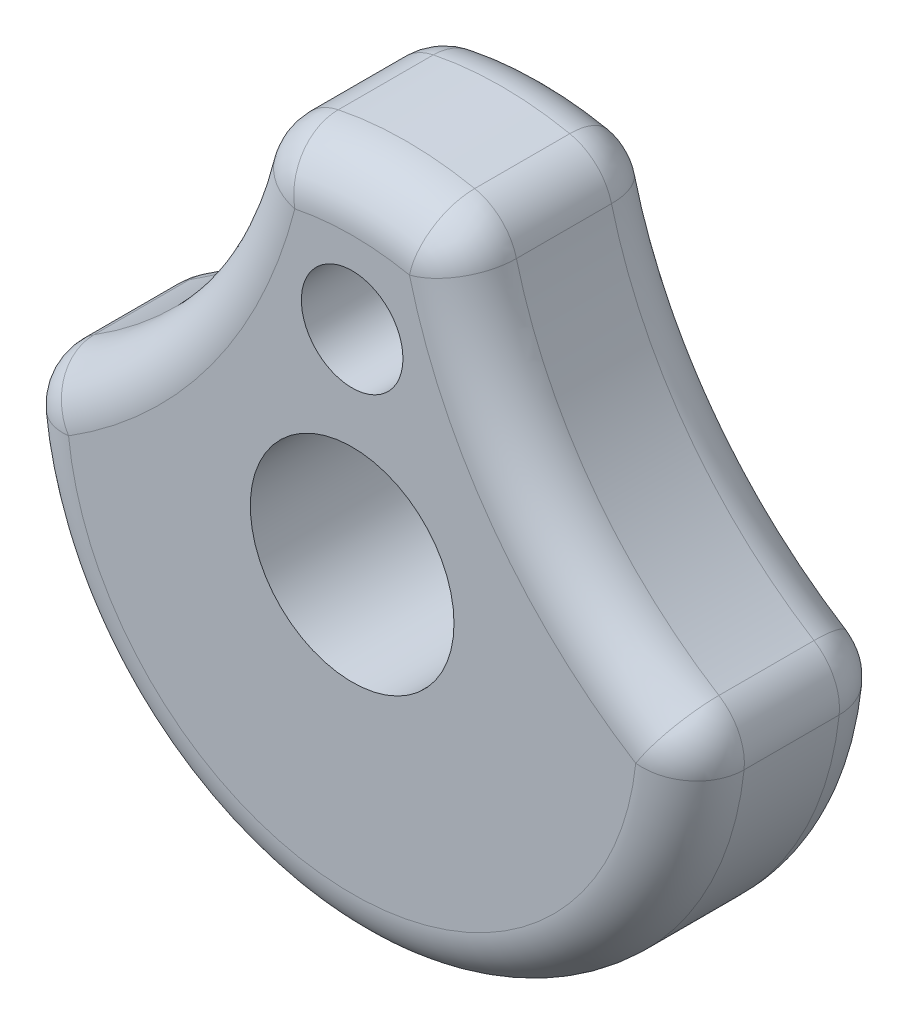
ISO-10303-21;
HEADER;
FILE_DESCRIPTION(('STEP AP214'),'2;1');
FILE_NAME('part.step','',(''),(''),'','','');
FILE_SCHEMA(('AUTOMOTIVE_DESIGN { 1 0 10303 214 1 1 1 1 }'));
ENDSEC;
DATA;
#1=APPLICATION_CONTEXT('core data for automotive mechanical design processes');
#2=APPLICATION_PROTOCOL_DEFINITION('international standard','automotive_design',2000,#1);
#3=PRODUCT_CONTEXT('',#1,'mechanical');
#4=PRODUCT('Part','Part','',(#3));
#5=PRODUCT_RELATED_PRODUCT_CATEGORY('part','',(#4));
#6=PRODUCT_DEFINITION_FORMATION('','',#4);
#7=PRODUCT_DEFINITION_CONTEXT('part definition',#1,'design');
#8=PRODUCT_DEFINITION('design','',#6,#7);
#9=PRODUCT_DEFINITION_SHAPE('','',#8);
#10=(LENGTH_UNIT() NAMED_UNIT(*) SI_UNIT(.MILLI.,.METRE.));
#11=(NAMED_UNIT(*) PLANE_ANGLE_UNIT() SI_UNIT($,.RADIAN.));
#12=(NAMED_UNIT(*) SI_UNIT($,.STERADIAN.) SOLID_ANGLE_UNIT());
#13=UNCERTAINTY_MEASURE_WITH_UNIT(LENGTH_MEASURE(1.E-05),#10,'distance_accuracy_value','');
#14=(GEOMETRIC_REPRESENTATION_CONTEXT(3) GLOBAL_UNCERTAINTY_ASSIGNED_CONTEXT((#13)) GLOBAL_UNIT_ASSIGNED_CONTEXT((#10,
#11,#12)) REPRESENTATION_CONTEXT('',''));
#15=CARTESIAN_POINT('',(0.,0.,0.));
#16=DIRECTION('',(0.,0.,1.));
#17=DIRECTION('',(1.,0.,0.));
#18=AXIS2_PLACEMENT_3D('',#15,#16,#17);
#19=CARTESIAN_POINT('',(0.,0.,9.525));
#20=DIRECTION('',(0.,0.,-1.));
#21=DIRECTION('',(-1.,0.,0.));
#22=AXIS2_PLACEMENT_3D('',#19,#20,#21);
#23=CYLINDRICAL_SURFACE('',#22,15.875);
#24=CARTESIAN_POINT('',(0.,0.,6.985));
#25=DIRECTION('',(0.,0.,1.));
#26=DIRECTION('',(1.,0.,0.));
#27=AXIS2_PLACEMENT_3D('',#24,#25,#26);
#28=CIRCLE('',#27,15.875);
#29=CARTESIAN_POINT('',(-3.19002680267098,15.5511849708709,6.985));
#30=VERTEX_POINT('',#29);
#31=CARTESIAN_POINT('',(3.19002680267099,15.5511849708709,6.985));
#32=VERTEX_POINT('',#31);
#33=EDGE_CURVE('E184',#30,#32,#28,.F.);
#34=ORIENTED_EDGE('',*,*,#33,.T.);
#35=DIRECTION('',(0.,0.,-1.));
#36=VECTOR('',#35,1.);
#37=CARTESIAN_POINT('',(3.19002680267099,15.5511849708709,9.525));
#38=LINE('',#37,#36);
#39=CARTESIAN_POINT('',(3.19002680267099,15.5511849708709,2.54));
#40=VERTEX_POINT('',#39);
#41=EDGE_CURVE('E59',#32,#40,#38,.T.);
#42=ORIENTED_EDGE('',*,*,#41,.T.);
#43=CARTESIAN_POINT('',(0.,0.,2.54));
#44=DIRECTION('',(0.,0.,1.));
#45=DIRECTION('',(1.,0.,0.));
#46=AXIS2_PLACEMENT_3D('',#43,#44,#45);
#47=CIRCLE('',#46,15.875);
#48=CARTESIAN_POINT('',(-3.19002680267098,15.5511849708709,2.54));
#49=VERTEX_POINT('',#48);
#50=EDGE_CURVE('E223',#40,#49,#47,.T.);
#51=ORIENTED_EDGE('',*,*,#50,.T.);
#52=DIRECTION('',(0.,0.,-1.));
#53=VECTOR('',#52,1.);
#54=CARTESIAN_POINT('',(-3.19002680267098,15.5511849708709,9.525));
#55=LINE('',#54,#53);
#56=EDGE_CURVE('E221',#49,#30,#55,.F.);
#57=ORIENTED_EDGE('',*,*,#56,.T.);
#58=EDGE_LOOP('',(#34,#42,#51,#57));
#59=FACE_BOUND('',#58,.T.);
#60=ADVANCED_FACE('F36',(#59),#23,.T.);
#61=DIRECTION('',(0.,0.,-1.));
#62=VECTOR('',#61,1.);
#63=CARTESIAN_POINT('',(-15.7849471296895,-1.68851091583894,9.525));
#64=LINE('',#63,#62);
#65=CARTESIAN_POINT('',(-15.7849471296895,-1.68851091583894,6.985));
#66=VERTEX_POINT('',#65);
#67=CARTESIAN_POINT('',(-15.7849471296895,-1.68851091583894,2.54));
#68=VERTEX_POINT('',#67);
#69=EDGE_CURVE('E139',#66,#68,#64,.T.);
#70=ORIENTED_EDGE('',*,*,#69,.T.);
#71=CARTESIAN_POINT('',(0.,0.,2.54));
#72=DIRECTION('',(0.,0.,1.));
#73=DIRECTION('',(1.,0.,0.));
#74=AXIS2_PLACEMENT_3D('',#71,#72,#73);
#75=CIRCLE('',#74,15.875);
#76=CARTESIAN_POINT('',(15.7849471296895,-1.68851091583895,2.54));
#77=VERTEX_POINT('',#76);
#78=EDGE_CURVE('E135',#68,#77,#75,.T.);
#79=ORIENTED_EDGE('',*,*,#78,.T.);
#80=DIRECTION('',(0.,0.,-1.));
#81=VECTOR('',#80,1.);
#82=CARTESIAN_POINT('',(15.7849471296895,-1.68851091583895,9.525));
#83=LINE('',#82,#81);
#84=CARTESIAN_POINT('',(15.7849471296895,-1.68851091583894,6.985));
#85=VERTEX_POINT('',#84);
#86=EDGE_CURVE('E127',#77,#85,#83,.F.);
#87=ORIENTED_EDGE('',*,*,#86,.T.);
#88=CARTESIAN_POINT('',(0.,0.,6.985));
#89=DIRECTION('',(0.,0.,1.));
#90=DIRECTION('',(1.,0.,0.));
#91=AXIS2_PLACEMENT_3D('',#88,#89,#90);
#92=CIRCLE('',#91,15.875);
#93=EDGE_CURVE('E132',#85,#66,#92,.F.);
#94=ORIENTED_EDGE('',*,*,#93,.T.);
#95=EDGE_LOOP('',(#70,#79,#87,#94));
#96=FACE_BOUND('',#95,.T.);
#97=ADVANCED_FACE('F130',(#96),#23,.T.);
#98=CARTESIAN_POINT('',(0.,0.,9.525));
#99=DIRECTION('',(0.,0.,1.));
#100=DIRECTION('',(1.,0.,0.));
#101=AXIS2_PLACEMENT_3D('',#98,#99,#100);
#102=PLANE('',#101);
#103=CARTESIAN_POINT('',(0.,0.,9.525));
#104=DIRECTION('',(0.,0.,1.));
#105=DIRECTION('',(1.,0.,0.));
#106=AXIS2_PLACEMENT_3D('',#103,#104,#105);
#107=CIRCLE('',#106,13.335);
#108=CARTESIAN_POINT('',(-13.2593555889392,-1.41834916930472,9.525));
#109=VERTEX_POINT('',#108);
#110=CARTESIAN_POINT('',(13.2593555889392,-1.41834916930472,9.525));
#111=VERTEX_POINT('',#110);
#112=EDGE_CURVE('E162',#109,#111,#107,.T.);
#113=ORIENTED_EDGE('',*,*,#112,.T.);
#114=CARTESIAN_POINT('',(26.0582746339193,19.0375685876683,9.525));
#115=DIRECTION('',(0.,0.,1.));
#116=DIRECTION('',(1.,0.,0.));
#117=AXIS2_PLACEMENT_3D('',#114,#115,#116);
#118=CIRCLE('',#117,24.13);
#119=CARTESIAN_POINT('',(2.67962251424362,13.0629953755315,9.525));
#120=VERTEX_POINT('',#119);
#121=EDGE_CURVE('E181',#111,#120,#118,.F.);
#122=ORIENTED_EDGE('',*,*,#121,.T.);
#123=CARTESIAN_POINT('',(0.,0.,9.525));
#124=DIRECTION('',(0.,0.,1.));
#125=DIRECTION('',(1.,0.,0.));
#126=AXIS2_PLACEMENT_3D('',#123,#124,#125);
#127=CIRCLE('',#126,13.335);
#128=CARTESIAN_POINT('',(-2.67962251424362,13.0629953755315,9.525));
#129=VERTEX_POINT('',#128);
#130=EDGE_CURVE('E178',#120,#129,#127,.T.);
#131=ORIENTED_EDGE('',*,*,#130,.T.);
#132=CARTESIAN_POINT('',(-26.0582746339193,19.0375685876683,9.525));
#133=DIRECTION('',(0.,0.,1.));
#134=DIRECTION('',(1.,0.,0.));
#135=AXIS2_PLACEMENT_3D('',#132,#133,#134);
#136=CIRCLE('',#135,24.13);
#137=EDGE_CURVE('E176',#129,#109,#136,.F.);
#138=ORIENTED_EDGE('',*,*,#137,.T.);
#139=EDGE_LOOP('',(#113,#122,#131,#138));
#140=FACE_BOUND('',#139,.T.);
#141=CARTESIAN_POINT('',(0.,9.525,9.525));
#142=DIRECTION('',(0.,0.,1.));
#143=DIRECTION('',(1.,0.,0.));
#144=AXIS2_PLACEMENT_3D('',#141,#142,#143);
#145=CIRCLE('',#144,2.3749);
#146=CARTESIAN_POINT('',(2.3749,9.525,9.525));
#147=VERTEX_POINT('',#146);
#148=EDGE_CURVE('E194',#147,#147,#145,.T.);
#149=ORIENTED_EDGE('',*,*,#148,.F.);
#150=EDGE_LOOP('',(#149));
#151=FACE_BOUND('',#150,.T.);
#152=CARTESIAN_POINT('',(0.,0.,9.525));
#153=DIRECTION('',(0.,0.,1.));
#154=DIRECTION('',(1.,0.,0.));
#155=AXIS2_PLACEMENT_3D('',#152,#153,#154);
#156=CIRCLE('',#155,4.7625);
#157=CARTESIAN_POINT('',(4.7625,0.,9.525));
#158=VERTEX_POINT('',#157);
#159=EDGE_CURVE('E574',#158,#158,#156,.T.);
#160=ORIENTED_EDGE('',*,*,#159,.F.);
#161=EDGE_LOOP('',(#160));
#162=FACE_BOUND('',#161,.T.);
#163=ADVANCED_FACE('F278',(#140,#151,#162),#102,.T.);
#164=CARTESIAN_POINT('',(0.,0.,0.));
#165=DIRECTION('',(0.,0.,1.));
#166=DIRECTION('',(1.,0.,0.));
#167=AXIS2_PLACEMENT_3D('',#164,#165,#166);
#168=PLANE('',#167);
#169=CARTESIAN_POINT('',(0.,0.,0.));
#170=DIRECTION('',(0.,0.,1.));
#171=DIRECTION('',(1.,0.,0.));
#172=AXIS2_PLACEMENT_3D('',#169,#170,#171);
#173=CIRCLE('',#172,13.335);
#174=CARTESIAN_POINT('',(13.2593555889392,-1.41834916930471,0.));
#175=VERTEX_POINT('',#174);
#176=CARTESIAN_POINT('',(-13.2593555889392,-1.41834916930471,0.));
#177=VERTEX_POINT('',#176);
#178=EDGE_CURVE('E207',#175,#177,#173,.F.);
#179=ORIENTED_EDGE('',*,*,#178,.T.);
#180=CARTESIAN_POINT('',(-26.0582746339193,19.0375685876683,0.));
#181=DIRECTION('',(0.,0.,1.));
#182=DIRECTION('',(1.,0.,0.));
#183=AXIS2_PLACEMENT_3D('',#180,#181,#182);
#184=CIRCLE('',#183,24.13);
#185=CARTESIAN_POINT('',(-2.67962251424362,13.0629953755315,0.));
#186=VERTEX_POINT('',#185);
#187=EDGE_CURVE('E209',#177,#186,#184,.T.);
#188=ORIENTED_EDGE('',*,*,#187,.T.);
#189=CARTESIAN_POINT('',(0.,0.,0.));
#190=DIRECTION('',(0.,0.,1.));
#191=DIRECTION('',(1.,0.,0.));
#192=AXIS2_PLACEMENT_3D('',#189,#190,#191);
#193=CIRCLE('',#192,13.335);
#194=CARTESIAN_POINT('',(2.67962251424362,13.0629953755315,0.));
#195=VERTEX_POINT('',#194);
#196=EDGE_CURVE('E205',#186,#195,#193,.F.);
#197=ORIENTED_EDGE('',*,*,#196,.T.);
#198=CARTESIAN_POINT('',(26.0582746339193,19.0375685876683,0.));
#199=DIRECTION('',(0.,0.,1.));
#200=DIRECTION('',(1.,0.,0.));
#201=AXIS2_PLACEMENT_3D('',#198,#199,#200);
#202=CIRCLE('',#201,24.13);
#203=EDGE_CURVE('E203',#195,#175,#202,.T.);
#204=ORIENTED_EDGE('',*,*,#203,.T.);
#205=EDGE_LOOP('',(#179,#188,#197,#204));
#206=FACE_BOUND('',#205,.T.);
#207=CARTESIAN_POINT('',(0.,9.525,0.));
#208=DIRECTION('',(0.,0.,1.));
#209=DIRECTION('',(1.,0.,0.));
#210=AXIS2_PLACEMENT_3D('',#207,#208,#209);
#211=CIRCLE('',#210,2.3749);
#212=CARTESIAN_POINT('',(2.3749,9.525,0.));
#213=VERTEX_POINT('',#212);
#214=EDGE_CURVE('E576',#213,#213,#211,.T.);
#215=ORIENTED_EDGE('',*,*,#214,.T.);
#216=EDGE_LOOP('',(#215));
#217=FACE_BOUND('',#216,.T.);
#218=CARTESIAN_POINT('',(0.,0.,0.));
#219=DIRECTION('',(0.,0.,1.));
#220=DIRECTION('',(1.,0.,0.));
#221=AXIS2_PLACEMENT_3D('',#218,#219,#220);
#222=CIRCLE('',#221,4.7625);
#223=CARTESIAN_POINT('',(4.7625,0.,0.));
#224=VERTEX_POINT('',#223);
#225=EDGE_CURVE('E165',#224,#224,#222,.T.);
#226=ORIENTED_EDGE('',*,*,#225,.T.);
#227=EDGE_LOOP('',(#226));
#228=FACE_BOUND('',#227,.T.);
#229=ADVANCED_FACE('F325',(#206,#217,#228),#168,.F.);
#230=CARTESIAN_POINT('',(0.,0.,0.));
#231=DIRECTION('',(0.,0.,1.));
#232=DIRECTION('',(1.,0.,0.));
#233=AXIS2_PLACEMENT_3D('',#230,#231,#232);
#234=CYLINDRICAL_SURFACE('',#233,4.7625);
#235=CARTESIAN_POINT('',(4.7625,0.,0.));
#236=CARTESIAN_POINT('',(4.7625,0.,0.0992187499999999));
#237=CARTESIAN_POINT('',(4.7625,0.,0.1984375));
#238=CARTESIAN_POINT('',(4.7625,0.,0.396875));
#239=CARTESIAN_POINT('',(4.7625,0.,0.49609375));
#240=CARTESIAN_POINT('',(4.7625,0.,0.69453125));
#241=CARTESIAN_POINT('',(4.7625,0.,0.79375));
#242=CARTESIAN_POINT('',(4.7625,0.,0.9921875));
#243=CARTESIAN_POINT('',(4.7625,0.,1.09140625));
#244=CARTESIAN_POINT('',(4.7625,0.,1.28984375));
#245=CARTESIAN_POINT('',(4.7625,0.,1.3890625));
#246=CARTESIAN_POINT('',(4.7625,0.,1.5875));
#247=CARTESIAN_POINT('',(4.7625,0.,1.68671875));
#248=CARTESIAN_POINT('',(4.7625,0.,1.88515625));
#249=CARTESIAN_POINT('',(4.7625,0.,1.984375));
#250=CARTESIAN_POINT('',(4.7625,0.,2.1828125));
#251=CARTESIAN_POINT('',(4.7625,0.,2.28203125));
#252=CARTESIAN_POINT('',(4.7625,0.,2.48046875));
#253=CARTESIAN_POINT('',(4.7625,0.,2.5796875));
#254=CARTESIAN_POINT('',(4.7625,0.,2.778125));
#255=CARTESIAN_POINT('',(4.7625,0.,2.87734375));
#256=CARTESIAN_POINT('',(4.7625,0.,3.07578125));
#257=CARTESIAN_POINT('',(4.7625,0.,3.175));
#258=CARTESIAN_POINT('',(4.7625,0.,3.3734375));
#259=CARTESIAN_POINT('',(4.7625,0.,3.47265625));
#260=CARTESIAN_POINT('',(4.7625,0.,3.67109375));
#261=CARTESIAN_POINT('',(4.7625,0.,3.7703125));
#262=CARTESIAN_POINT('',(4.7625,0.,3.96875));
#263=CARTESIAN_POINT('',(4.7625,0.,4.06796875));
#264=CARTESIAN_POINT('',(4.7625,0.,4.26640625));
#265=CARTESIAN_POINT('',(4.7625,0.,4.365625));
#266=CARTESIAN_POINT('',(4.7625,0.,4.5640625));
#267=CARTESIAN_POINT('',(4.7625,0.,4.66328125));
#268=CARTESIAN_POINT('',(4.7625,0.,4.86171875));
#269=CARTESIAN_POINT('',(4.7625,0.,4.9609375));
#270=CARTESIAN_POINT('',(4.7625,0.,5.159375));
#271=CARTESIAN_POINT('',(4.7625,0.,5.25859375));
#272=CARTESIAN_POINT('',(4.7625,0.,5.45703125));
#273=CARTESIAN_POINT('',(4.7625,0.,5.55625));
#274=CARTESIAN_POINT('',(4.7625,0.,5.7546875));
#275=CARTESIAN_POINT('',(4.7625,0.,5.85390625));
#276=CARTESIAN_POINT('',(4.7625,0.,6.05234375));
#277=CARTESIAN_POINT('',(4.7625,0.,6.1515625));
#278=CARTESIAN_POINT('',(4.7625,0.,6.35));
#279=CARTESIAN_POINT('',(4.7625,0.,6.44921875));
#280=CARTESIAN_POINT('',(4.7625,0.,6.64765625));
#281=CARTESIAN_POINT('',(4.7625,0.,6.746875));
#282=CARTESIAN_POINT('',(4.7625,0.,6.9453125));
#283=CARTESIAN_POINT('',(4.7625,0.,7.04453125));
#284=CARTESIAN_POINT('',(4.7625,0.,7.24296875));
#285=CARTESIAN_POINT('',(4.7625,0.,7.3421875));
#286=CARTESIAN_POINT('',(4.7625,0.,7.540625));
#287=CARTESIAN_POINT('',(4.7625,0.,7.63984375));
#288=CARTESIAN_POINT('',(4.7625,0.,7.83828125));
#289=CARTESIAN_POINT('',(4.7625,0.,7.9375));
#290=CARTESIAN_POINT('',(4.7625,0.,8.1359375));
#291=CARTESIAN_POINT('',(4.7625,0.,8.23515625));
#292=CARTESIAN_POINT('',(4.7625,0.,8.43359375));
#293=CARTESIAN_POINT('',(4.7625,0.,8.5328125));
#294=CARTESIAN_POINT('',(4.7625,0.,8.73125));
#295=CARTESIAN_POINT('',(4.7625,0.,8.83046875));
#296=CARTESIAN_POINT('',(4.7625,0.,9.02890625));
#297=CARTESIAN_POINT('',(4.7625,0.,9.128125));
#298=CARTESIAN_POINT('',(4.7625,0.,9.3265625));
#299=CARTESIAN_POINT('',(4.7625,0.,9.42578125));
#300=CARTESIAN_POINT('',(4.7625,0.,9.525));
#301=B_SPLINE_CURVE_WITH_KNOTS('',3,(#235,#236,#237,#238,#239,#240,#241,#242,#243,#244,#245,
#246,#247,#248,#249,#250,#251,#252,#253,#254,#255,#256,#257,#258,#259,#260,#261,#262,#263,#264,
#265,#266,#267,#268,#269,#270,#271,#272,#273,#274,#275,#276,#277,#278,#279,#280,#281,#282,#283,
#284,#285,#286,#287,#288,#289,#290,#291,#292,#293,#294,#295,#296,#297,#298,#299,#300),
.UNSPECIFIED.,.F.,.F.,(4,2,2,2,2,2,2,2,2,2,2,2,2,2,2,2,2,2,2,2,2,2,2,2,2,2,2,2,2,2,2,2,4),(0.,
0.29765625,0.5953125,0.89296875,1.190625,1.48828125,1.7859375,2.08359375,2.38125,2.67890625,
2.9765625,3.27421875,3.571875,3.86953125,4.1671875,4.46484375,4.7625,5.06015625,5.3578125,
5.65546875,5.953125,6.25078125,6.5484375,6.84609375,7.14375,7.44140625,7.7390625,8.03671875,
8.334375,8.63203125,8.9296875,9.22734375,9.525),.UNSPECIFIED.);
#302=EDGE_CURVE('BSEAM520',#224,#158,#301,.T.);
#303=ORIENTED_EDGE('',*,*,#225,.F.);
#304=ORIENTED_EDGE('',*,*,#159,.T.);
#305=ORIENTED_EDGE('',*,*,#302,.T.);
#306=ORIENTED_EDGE('',*,*,#302,.F.);
#307=EDGE_LOOP('',(#303,#305,#304,#306));
#308=FACE_BOUND('',#307,.T.);
#309=ADVANCED_FACE('F520',(#308),#234,.F.);
#310=CARTESIAN_POINT('',(0.,9.525,0.));
#311=DIRECTION('',(0.,0.,1.));
#312=DIRECTION('',(1.,0.,0.));
#313=AXIS2_PLACEMENT_3D('',#310,#311,#312);
#314=CYLINDRICAL_SURFACE('',#313,2.3749);
#315=CARTESIAN_POINT('',(2.3749,9.525,0.));
#316=CARTESIAN_POINT('',(2.3749,9.525,0.0992187499999999));
#317=CARTESIAN_POINT('',(2.3749,9.525,0.1984375));
#318=CARTESIAN_POINT('',(2.3749,9.525,0.396875));
#319=CARTESIAN_POINT('',(2.3749,9.525,0.49609375));
#320=CARTESIAN_POINT('',(2.3749,9.525,0.69453125));
#321=CARTESIAN_POINT('',(2.3749,9.525,0.79375));
#322=CARTESIAN_POINT('',(2.3749,9.525,0.9921875));
#323=CARTESIAN_POINT('',(2.3749,9.525,1.09140625));
#324=CARTESIAN_POINT('',(2.3749,9.525,1.28984375));
#325=CARTESIAN_POINT('',(2.3749,9.525,1.3890625));
#326=CARTESIAN_POINT('',(2.3749,9.525,1.5875));
#327=CARTESIAN_POINT('',(2.3749,9.525,1.68671875));
#328=CARTESIAN_POINT('',(2.3749,9.525,1.88515625));
#329=CARTESIAN_POINT('',(2.3749,9.525,1.984375));
#330=CARTESIAN_POINT('',(2.3749,9.525,2.1828125));
#331=CARTESIAN_POINT('',(2.3749,9.525,2.28203125));
#332=CARTESIAN_POINT('',(2.3749,9.525,2.48046875));
#333=CARTESIAN_POINT('',(2.3749,9.525,2.5796875));
#334=CARTESIAN_POINT('',(2.3749,9.525,2.778125));
#335=CARTESIAN_POINT('',(2.3749,9.525,2.87734375));
#336=CARTESIAN_POINT('',(2.3749,9.525,3.07578125));
#337=CARTESIAN_POINT('',(2.3749,9.525,3.175));
#338=CARTESIAN_POINT('',(2.3749,9.525,3.3734375));
#339=CARTESIAN_POINT('',(2.3749,9.525,3.47265625));
#340=CARTESIAN_POINT('',(2.3749,9.525,3.67109375));
#341=CARTESIAN_POINT('',(2.3749,9.525,3.7703125));
#342=CARTESIAN_POINT('',(2.3749,9.525,3.96875));
#343=CARTESIAN_POINT('',(2.3749,9.525,4.06796875));
#344=CARTESIAN_POINT('',(2.3749,9.525,4.26640625));
#345=CARTESIAN_POINT('',(2.3749,9.525,4.365625));
#346=CARTESIAN_POINT('',(2.3749,9.525,4.5640625));
#347=CARTESIAN_POINT('',(2.3749,9.525,4.66328125));
#348=CARTESIAN_POINT('',(2.3749,9.525,4.86171875));
#349=CARTESIAN_POINT('',(2.3749,9.525,4.9609375));
#350=CARTESIAN_POINT('',(2.3749,9.525,5.159375));
#351=CARTESIAN_POINT('',(2.3749,9.525,5.25859375));
#352=CARTESIAN_POINT('',(2.3749,9.525,5.45703125));
#353=CARTESIAN_POINT('',(2.3749,9.525,5.55625));
#354=CARTESIAN_POINT('',(2.3749,9.525,5.7546875));
#355=CARTESIAN_POINT('',(2.3749,9.525,5.85390625));
#356=CARTESIAN_POINT('',(2.3749,9.525,6.05234375));
#357=CARTESIAN_POINT('',(2.3749,9.525,6.1515625));
#358=CARTESIAN_POINT('',(2.3749,9.525,6.35));
#359=CARTESIAN_POINT('',(2.3749,9.525,6.44921875));
#360=CARTESIAN_POINT('',(2.3749,9.525,6.64765625));
#361=CARTESIAN_POINT('',(2.3749,9.525,6.746875));
#362=CARTESIAN_POINT('',(2.3749,9.525,6.9453125));
#363=CARTESIAN_POINT('',(2.3749,9.525,7.04453125));
#364=CARTESIAN_POINT('',(2.3749,9.525,7.24296875));
#365=CARTESIAN_POINT('',(2.3749,9.525,7.3421875));
#366=CARTESIAN_POINT('',(2.3749,9.525,7.540625));
#367=CARTESIAN_POINT('',(2.3749,9.525,7.63984375));
#368=CARTESIAN_POINT('',(2.3749,9.525,7.83828125));
#369=CARTESIAN_POINT('',(2.3749,9.525,7.9375));
#370=CARTESIAN_POINT('',(2.3749,9.525,8.1359375));
#371=CARTESIAN_POINT('',(2.3749,9.525,8.23515625));
#372=CARTESIAN_POINT('',(2.3749,9.525,8.43359375));
#373=CARTESIAN_POINT('',(2.3749,9.525,8.5328125));
#374=CARTESIAN_POINT('',(2.3749,9.525,8.73125));
#375=CARTESIAN_POINT('',(2.3749,9.525,8.83046875));
#376=CARTESIAN_POINT('',(2.3749,9.525,9.02890625));
#377=CARTESIAN_POINT('',(2.3749,9.525,9.128125));
#378=CARTESIAN_POINT('',(2.3749,9.525,9.3265625));
#379=CARTESIAN_POINT('',(2.3749,9.525,9.42578125));
#380=CARTESIAN_POINT('',(2.3749,9.525,9.525));
#381=B_SPLINE_CURVE_WITH_KNOTS('',3,(#315,#316,#317,#318,#319,#320,#321,#322,#323,#324,#325,
#326,#327,#328,#329,#330,#331,#332,#333,#334,#335,#336,#337,#338,#339,#340,#341,#342,#343,#344,
#345,#346,#347,#348,#349,#350,#351,#352,#353,#354,#355,#356,#357,#358,#359,#360,#361,#362,#363,
#364,#365,#366,#367,#368,#369,#370,#371,#372,#373,#374,#375,#376,#377,#378,#379,#380),
.UNSPECIFIED.,.F.,.F.,(4,2,2,2,2,2,2,2,2,2,2,2,2,2,2,2,2,2,2,2,2,2,2,2,2,2,2,2,2,2,2,2,4),(0.,
0.29765625,0.5953125,0.89296875,1.190625,1.48828125,1.7859375,2.08359375,2.38125,2.67890625,
2.9765625,3.27421875,3.571875,3.86953125,4.1671875,4.46484375,4.7625,5.06015625,5.3578125,
5.65546875,5.953125,6.25078125,6.5484375,6.84609375,7.14375,7.44140625,7.7390625,8.03671875,
8.334375,8.63203125,8.9296875,9.22734375,9.525),.UNSPECIFIED.);
#382=EDGE_CURVE('BSEAM507',#213,#147,#381,.T.);
#383=ORIENTED_EDGE('',*,*,#214,.F.);
#384=ORIENTED_EDGE('',*,*,#148,.T.);
#385=ORIENTED_EDGE('',*,*,#382,.T.);
#386=ORIENTED_EDGE('',*,*,#382,.F.);
#387=EDGE_LOOP('',(#383,#385,#384,#386));
#388=FACE_BOUND('',#387,.T.);
#389=ADVANCED_FACE('F507',(#388),#314,.F.);
#390=CARTESIAN_POINT('',(26.0582746339193,19.0375685876683,0.));
#391=DIRECTION('',(0.,0.,1.));
#392=DIRECTION('',(1.,0.,0.));
#393=AXIS2_PLACEMENT_3D('',#390,#391,#392);
#394=CYLINDRICAL_SURFACE('',#393,21.59);
#395=CARTESIAN_POINT('',(26.0582746339193,19.0375685876683,2.54));
#396=DIRECTION('',(0.,0.,1.));
#397=DIRECTION('',(1.,0.,0.));
#398=AXIS2_PLACEMENT_3D('',#395,#396,#397);
#399=CIRCLE('',#398,21.59);
#400=CARTESIAN_POINT('',(14.6066102252529,0.734905331429288,2.54));
#401=VERTEX_POINT('',#400);
#402=CARTESIAN_POINT('',(5.14053326368318,13.6918978189144,2.54));
#403=VERTEX_POINT('',#402);
#404=EDGE_CURVE('E45',#401,#403,#399,.F.);
#405=ORIENTED_EDGE('',*,*,#404,.T.);
#406=DIRECTION('',(0.,0.,1.));
#407=VECTOR('',#406,1.);
#408=CARTESIAN_POINT('',(5.14053326368318,13.6918978189144,0.));
#409=LINE('',#408,#407);
#410=CARTESIAN_POINT('',(5.14053326368318,13.6918978189144,6.985));
#411=VERTEX_POINT('',#410);
#412=EDGE_CURVE('E11',#403,#411,#409,.T.);
#413=ORIENTED_EDGE('',*,*,#412,.T.);
#414=CARTESIAN_POINT('',(26.0582746339193,19.0375685876683,6.985));
#415=DIRECTION('',(0.,0.,1.));
#416=DIRECTION('',(1.,0.,0.));
#417=AXIS2_PLACEMENT_3D('',#414,#415,#416);
#418=CIRCLE('',#417,21.59);
#419=CARTESIAN_POINT('',(14.6066102252529,0.734905331429288,6.985));
#420=VERTEX_POINT('',#419);
#421=EDGE_CURVE('E138',#411,#420,#418,.T.);
#422=ORIENTED_EDGE('',*,*,#421,.T.);
#423=DIRECTION('',(0.,0.,1.));
#424=VECTOR('',#423,1.);
#425=CARTESIAN_POINT('',(14.6066102252529,0.734905331429288,0.));
#426=LINE('',#425,#424);
#427=EDGE_CURVE('E146',#420,#401,#426,.F.);
#428=ORIENTED_EDGE('',*,*,#427,.T.);
#429=EDGE_LOOP('',(#405,#413,#422,#428));
#430=FACE_BOUND('',#429,.T.);
#431=ADVANCED_FACE('F302',(#430),#394,.F.);
#432=CARTESIAN_POINT('',(-26.0582746339193,19.0375685876683,0.));
#433=DIRECTION('',(0.,0.,1.));
#434=DIRECTION('',(1.,0.,0.));
#435=AXIS2_PLACEMENT_3D('',#432,#433,#434);
#436=CYLINDRICAL_SURFACE('',#435,21.59);
#437=DIRECTION('',(0.,0.,1.));
#438=VECTOR('',#437,1.);
#439=CARTESIAN_POINT('',(-5.14053326368318,13.6918978189144,0.));
#440=LINE('',#439,#438);
#441=CARTESIAN_POINT('',(-5.14053326368318,13.6918978189144,6.985));
#442=VERTEX_POINT('',#441);
#443=CARTESIAN_POINT('',(-5.14053326368317,13.6918978189144,2.54));
#444=VERTEX_POINT('',#443);
#445=EDGE_CURVE('E212',#442,#444,#440,.F.);
#446=ORIENTED_EDGE('',*,*,#445,.T.);
#447=CARTESIAN_POINT('',(-26.0582746339193,19.0375685876683,2.54));
#448=DIRECTION('',(0.,0.,1.));
#449=DIRECTION('',(1.,0.,0.));
#450=AXIS2_PLACEMENT_3D('',#447,#448,#449);
#451=CIRCLE('',#450,21.59);
#452=CARTESIAN_POINT('',(-14.6066102252529,0.734905331429288,2.54));
#453=VERTEX_POINT('',#452);
#454=EDGE_CURVE('E214',#444,#453,#451,.F.);
#455=ORIENTED_EDGE('',*,*,#454,.T.);
#456=DIRECTION('',(0.,0.,1.));
#457=VECTOR('',#456,1.);
#458=CARTESIAN_POINT('',(-14.6066102252529,0.734905331429288,0.));
#459=LINE('',#458,#457);
#460=CARTESIAN_POINT('',(-14.6066102252529,0.734905331429287,6.985));
#461=VERTEX_POINT('',#460);
#462=EDGE_CURVE('E174',#453,#461,#459,.T.);
#463=ORIENTED_EDGE('',*,*,#462,.T.);
#464=CARTESIAN_POINT('',(-26.0582746339193,19.0375685876683,6.985));
#465=DIRECTION('',(0.,0.,1.));
#466=DIRECTION('',(1.,0.,0.));
#467=AXIS2_PLACEMENT_3D('',#464,#465,#466);
#468=CIRCLE('',#467,21.59);
#469=EDGE_CURVE('E157',#461,#442,#468,.T.);
#470=ORIENTED_EDGE('',*,*,#469,.T.);
#471=EDGE_LOOP('',(#446,#455,#463,#470));
#472=FACE_BOUND('',#471,.T.);
#473=ADVANCED_FACE('F348',(#472),#436,.F.);
#474=CARTESIAN_POINT('',(0.,0.,6.985));
#475=DIRECTION('',(0.,0.,1.));
#476=DIRECTION('',(1.,0.,0.));
#477=AXIS2_PLACEMENT_3D('',#474,#475,#476);
#478=TOROIDAL_SURFACE('',#477,13.335,2.54);
#479=ORIENTED_EDGE('',*,*,#93,.F.);
#480=CARTESIAN_POINT('',(13.2593555889392,-1.41834916930471,6.985));
#481=DIRECTION('',(0.106362892336311,0.994327378248157,0.));
#482=DIRECTION('',(-0.994327378248157,0.106362892336311,0.));
#483=AXIS2_PLACEMENT_3D('',#480,#481,#482);
#484=CIRCLE('',#483,2.54);
#485=EDGE_CURVE('E151',#85,#111,#484,.F.);
#486=ORIENTED_EDGE('',*,*,#485,.T.);
#487=ORIENTED_EDGE('',*,*,#112,.F.);
#488=CARTESIAN_POINT('',(-13.2593555889392,-1.41834916930471,6.985));
#489=DIRECTION('',(0.106362892336311,-0.994327378248157,0.));
#490=DIRECTION('',(0.994327378248157,0.106362892336311,0.));
#491=AXIS2_PLACEMENT_3D('',#488,#489,#490);
#492=CIRCLE('',#491,2.54);
#493=EDGE_CURVE('E158',#109,#66,#492,.T.);
#494=ORIENTED_EDGE('',*,*,#493,.T.);
#495=EDGE_LOOP('',(#479,#486,#487,#494));
#496=FACE_BOUND('',#495,.T.);
#497=ADVANCED_FACE('F160',(#496),#478,.T.);
#498=CARTESIAN_POINT('',(-13.2593555889392,-1.41834916930471,9.525));
#499=DIRECTION('',(0.,0.,-1.));
#500=DIRECTION('',(-1.,0.,0.));
#501=AXIS2_PLACEMENT_3D('',#498,#499,#500);
#502=CYLINDRICAL_SURFACE('',#501,2.54);
#503=ORIENTED_EDGE('',*,*,#462,.F.);
#504=CARTESIAN_POINT('',(-13.2593555889392,-1.41834916930471,2.54));
#505=DIRECTION('',(0.,0.,-1.));
#506=DIRECTION('',(-1.,0.,0.));
#507=AXIS2_PLACEMENT_3D('',#504,#505,#506);
#508=CIRCLE('',#507,2.54);
#509=EDGE_CURVE('E216',#453,#68,#508,.F.);
#510=ORIENTED_EDGE('',*,*,#509,.T.);
#511=ORIENTED_EDGE('',*,*,#69,.F.);
#512=CARTESIAN_POINT('',(-13.2593555889392,-1.41834916930471,6.985));
#513=DIRECTION('',(0.,0.,1.));
#514=DIRECTION('',(1.,0.,0.));
#515=AXIS2_PLACEMENT_3D('',#512,#513,#514);
#516=CIRCLE('',#515,2.54);
#517=EDGE_CURVE('E191',#461,#66,#516,.T.);
#518=ORIENTED_EDGE('',*,*,#517,.F.);
#519=EDGE_LOOP('',(#503,#510,#511,#518));
#520=FACE_BOUND('',#519,.T.);
#521=ADVANCED_FACE('F290',(#520),#502,.T.);
#522=CARTESIAN_POINT('',(-13.2593555889392,-1.41834916930471,6.985));
#523=DIRECTION('',(0.530415211147127,-0.847737992414961,0.));
#524=DIRECTION('',(0.847737992414961,0.530415211147127,0.));
#525=AXIS2_PLACEMENT_3D('',#522,#523,#524);
#526=SPHERICAL_SURFACE('',#525,2.54);
#527=ORIENTED_EDGE('',*,*,#517,.T.);
#528=ORIENTED_EDGE('',*,*,#493,.F.);
#529=CARTESIAN_POINT('',(-13.2593555889392,-1.41834916930471,6.985));
#530=DIRECTION('',(0.847737992414961,0.530415211147127,0.));
#531=DIRECTION('',(-0.530415211147127,0.847737992414961,0.));
#532=AXIS2_PLACEMENT_3D('',#529,#530,#531);
#533=CIRCLE('',#532,2.54);
#534=EDGE_CURVE('E188',#461,#109,#533,.T.);
#535=ORIENTED_EDGE('',*,*,#534,.F.);
#536=EDGE_LOOP('',(#527,#528,#535));
#537=FACE_BOUND('',#536,.T.);
#538=ADVANCED_FACE('F286',(#537),#526,.T.);
#539=CARTESIAN_POINT('',(-26.0582746339193,19.0375685876683,6.985));
#540=DIRECTION('',(0.,0.,1.));
#541=DIRECTION('',(1.,0.,0.));
#542=AXIS2_PLACEMENT_3D('',#539,#540,#541);
#543=TOROIDAL_SURFACE('',#542,24.13,2.54);
#544=ORIENTED_EDGE('',*,*,#137,.F.);
#545=CARTESIAN_POINT('',(-2.67962251424362,13.0629953755316,6.985));
#546=DIRECTION('',(0.247599387158589,0.96886249977935,0.));
#547=DIRECTION('',(-0.96886249977935,0.247599387158589,0.));
#548=AXIS2_PLACEMENT_3D('',#545,#546,#547);
#549=CIRCLE('',#548,2.54);
#550=EDGE_CURVE('E201',#129,#442,#549,.F.);
#551=ORIENTED_EDGE('',*,*,#550,.T.);
#552=ORIENTED_EDGE('',*,*,#469,.F.);
#553=ORIENTED_EDGE('',*,*,#534,.T.);
#554=EDGE_LOOP('',(#544,#551,#552,#553));
#555=FACE_BOUND('',#554,.T.);
#556=ADVANCED_FACE('F282',(#555),#543,.T.);
#557=CARTESIAN_POINT('',(0.,0.,6.985));
#558=DIRECTION('',(0.,0.,1.));
#559=DIRECTION('',(1.,0.,0.));
#560=AXIS2_PLACEMENT_3D('',#557,#558,#559);
#561=TOROIDAL_SURFACE('',#560,13.335,2.54);
#562=ORIENTED_EDGE('',*,*,#130,.F.);
#563=CARTESIAN_POINT('',(2.67962251424363,13.0629953755316,6.985));
#564=DIRECTION('',(-0.979602202889505,0.200946570246991,0.));
#565=DIRECTION('',(-0.200946570246991,-0.979602202889505,0.));
#566=AXIS2_PLACEMENT_3D('',#563,#564,#565);
#567=CIRCLE('',#566,2.54);
#568=EDGE_CURVE('E199',#120,#32,#567,.T.);
#569=ORIENTED_EDGE('',*,*,#568,.T.);
#570=ORIENTED_EDGE('',*,*,#33,.F.);
#571=CARTESIAN_POINT('',(-2.67962251424362,13.0629953755316,6.985));
#572=DIRECTION('',(-0.979602202889505,-0.200946570246991,0.));
#573=DIRECTION('',(0.200946570246991,-0.979602202889505,0.));
#574=AXIS2_PLACEMENT_3D('',#571,#572,#573);
#575=CIRCLE('',#574,2.54);
#576=EDGE_CURVE('E197',#30,#129,#575,.F.);
#577=ORIENTED_EDGE('',*,*,#576,.T.);
#578=EDGE_LOOP('',(#562,#569,#570,#577));
#579=FACE_BOUND('',#578,.T.);
#580=ADVANCED_FACE('F275',(#579),#561,.T.);
#581=CARTESIAN_POINT('',(26.0582746339193,19.0375685876683,6.985));
#582=DIRECTION('',(0.,0.,1.));
#583=DIRECTION('',(1.,0.,0.));
#584=AXIS2_PLACEMENT_3D('',#581,#582,#583);
#585=TOROIDAL_SURFACE('',#584,24.13,2.54);
#586=ORIENTED_EDGE('',*,*,#421,.F.);
#587=CARTESIAN_POINT('',(2.67962251424363,13.0629953755315,6.985));
#588=DIRECTION('',(0.247599387158589,-0.96886249977935,0.));
#589=DIRECTION('',(0.96886249977935,0.247599387158589,0.));
#590=AXIS2_PLACEMENT_3D('',#587,#588,#589);
#591=CIRCLE('',#590,2.54);
#592=EDGE_CURVE('E185',#411,#120,#591,.T.);
#593=ORIENTED_EDGE('',*,*,#592,.T.);
#594=ORIENTED_EDGE('',*,*,#121,.F.);
#595=CARTESIAN_POINT('',(13.2593555889392,-1.41834916930471,6.985));
#596=DIRECTION('',(0.847737992414961,-0.530415211147127,0.));
#597=DIRECTION('',(0.530415211147127,0.847737992414961,0.));
#598=AXIS2_PLACEMENT_3D('',#595,#596,#597);
#599=CIRCLE('',#598,2.54);
#600=EDGE_CURVE('E149',#420,#111,#599,.T.);
#601=ORIENTED_EDGE('',*,*,#600,.F.);
#602=EDGE_LOOP('',(#586,#593,#594,#601));
#603=FACE_BOUND('',#602,.T.);
#604=ADVANCED_FACE('F307',(#603),#585,.T.);
#605=CARTESIAN_POINT('',(13.2593555889392,-1.41834916930471,6.985));
#606=DIRECTION('',(-0.530415211147127,-0.847737992414961,0.));
#607=DIRECTION('',(0.847737992414961,-0.530415211147127,0.));
#608=AXIS2_PLACEMENT_3D('',#605,#606,#607);
#609=SPHERICAL_SURFACE('',#608,2.54);
#610=ORIENTED_EDGE('',*,*,#600,.T.);
#611=ORIENTED_EDGE('',*,*,#485,.F.);
#612=CARTESIAN_POINT('',(13.2593555889392,-1.41834916930471,6.985));
#613=DIRECTION('',(0.,0.,-1.));
#614=DIRECTION('',(-1.,0.,0.));
#615=AXIS2_PLACEMENT_3D('',#612,#613,#614);
#616=CIRCLE('',#615,2.54);
#617=EDGE_CURVE('E143',#420,#85,#616,.T.);
#618=ORIENTED_EDGE('',*,*,#617,.F.);
#619=EDGE_LOOP('',(#610,#611,#618));
#620=FACE_BOUND('',#619,.T.);
#621=ADVANCED_FACE('F152',(#620),#609,.T.);
#622=CARTESIAN_POINT('',(13.2593555889392,-1.41834916930472,0.));
#623=DIRECTION('',(0.,0.,-1.));
#624=DIRECTION('',(-1.,0.,0.));
#625=AXIS2_PLACEMENT_3D('',#622,#623,#624);
#626=CYLINDRICAL_SURFACE('',#625,2.54);
#627=ORIENTED_EDGE('',*,*,#86,.F.);
#628=CARTESIAN_POINT('',(13.2593555889392,-1.41834916930472,2.54));
#629=DIRECTION('',(0.,0.,-1.));
#630=DIRECTION('',(-1.,0.,0.));
#631=AXIS2_PLACEMENT_3D('',#628,#629,#630);
#632=CIRCLE('',#631,2.54);
#633=EDGE_CURVE('E219',#77,#401,#632,.F.);
#634=ORIENTED_EDGE('',*,*,#633,.T.);
#635=ORIENTED_EDGE('',*,*,#427,.F.);
#636=ORIENTED_EDGE('',*,*,#617,.T.);
#637=EDGE_LOOP('',(#627,#634,#635,#636));
#638=FACE_BOUND('',#637,.T.);
#639=ADVANCED_FACE('F145',(#638),#626,.T.);
#640=CARTESIAN_POINT('',(-2.67962251424362,13.0629953755316,6.985));
#641=DIRECTION('',(0.,0.,1.));
#642=DIRECTION('',(1.,0.,0.));
#643=AXIS2_PLACEMENT_3D('',#640,#641,#642);
#644=SPHERICAL_SURFACE('',#643,2.54);
#645=ORIENTED_EDGE('',*,*,#550,.F.);
#646=ORIENTED_EDGE('',*,*,#576,.F.);
#647=CARTESIAN_POINT('',(-2.67962251424363,13.0629953755316,6.985));
#648=DIRECTION('',(0.,0.,-1.));
#649=DIRECTION('',(-1.,0.,0.));
#650=AXIS2_PLACEMENT_3D('',#647,#648,#649);
#651=CIRCLE('',#650,2.54);
#652=EDGE_CURVE('E40',#442,#30,#651,.T.);
#653=ORIENTED_EDGE('',*,*,#652,.F.);
#654=EDGE_LOOP('',(#645,#646,#653));
#655=FACE_BOUND('',#654,.T.);
#656=ADVANCED_FACE('F38',(#655),#644,.T.);
#657=CARTESIAN_POINT('',(-13.2593555889392,-1.41834916930471,2.54));
#658=DIRECTION('',(0.,0.,1.));
#659=DIRECTION('',(1.,0.,0.));
#660=AXIS2_PLACEMENT_3D('',#657,#658,#659);
#661=SPHERICAL_SURFACE('',#660,2.54);
#662=CARTESIAN_POINT('',(-13.2593555889392,-1.41834916930471,2.54));
#663=DIRECTION('',(0.106362892336311,-0.994327378248157,0.));
#664=DIRECTION('',(0.994327378248158,0.106362892336311,0.));
#665=AXIS2_PLACEMENT_3D('',#662,#663,#664);
#666=CIRCLE('',#665,2.54);
#667=EDGE_CURVE('E254',#68,#177,#666,.T.);
#668=ORIENTED_EDGE('',*,*,#667,.F.);
#669=ORIENTED_EDGE('',*,*,#509,.F.);
#670=CARTESIAN_POINT('',(-13.2593555889392,-1.41834916930471,2.54));
#671=DIRECTION('',(0.847737992414961,0.530415211147128,0.));
#672=DIRECTION('',(-0.530415211147128,0.847737992414961,0.));
#673=AXIS2_PLACEMENT_3D('',#670,#671,#672);
#674=CIRCLE('',#673,2.54);
#675=EDGE_CURVE('E256',#177,#453,#674,.T.);
#676=ORIENTED_EDGE('',*,*,#675,.F.);
#677=EDGE_LOOP('',(#668,#669,#676));
#678=FACE_BOUND('',#677,.T.);
#679=ADVANCED_FACE('F294',(#678),#661,.T.);
#680=CARTESIAN_POINT('',(-2.67962251424363,13.0629953755315,0.));
#681=DIRECTION('',(0.,0.,-1.));
#682=DIRECTION('',(-1.,0.,0.));
#683=AXIS2_PLACEMENT_3D('',#680,#681,#682);
#684=CYLINDRICAL_SURFACE('',#683,2.54);
#685=ORIENTED_EDGE('',*,*,#652,.T.);
#686=ORIENTED_EDGE('',*,*,#56,.F.);
#687=CARTESIAN_POINT('',(-2.67962251424362,13.0629953755315,2.54));
#688=DIRECTION('',(0.,0.,-1.));
#689=DIRECTION('',(-1.,0.,0.));
#690=AXIS2_PLACEMENT_3D('',#687,#688,#689);
#691=CIRCLE('',#690,2.54);
#692=EDGE_CURVE('E251',#444,#49,#691,.T.);
#693=ORIENTED_EDGE('',*,*,#692,.F.);
#694=ORIENTED_EDGE('',*,*,#445,.F.);
#695=EDGE_LOOP('',(#685,#686,#693,#694));
#696=FACE_BOUND('',#695,.T.);
#697=ADVANCED_FACE('F267',(#696),#684,.T.);
#698=CARTESIAN_POINT('',(-26.0582746339193,19.0375685876683,2.54));
#699=DIRECTION('',(0.,0.,1.));
#700=DIRECTION('',(1.,0.,0.));
#701=AXIS2_PLACEMENT_3D('',#698,#699,#700);
#702=TOROIDAL_SURFACE('',#701,24.13,2.54);
#703=ORIENTED_EDGE('',*,*,#675,.T.);
#704=ORIENTED_EDGE('',*,*,#454,.F.);
#705=CARTESIAN_POINT('',(-2.67962251424362,13.0629953755315,2.54));
#706=DIRECTION('',(0.247599387158589,0.96886249977935,0.));
#707=DIRECTION('',(-0.96886249977935,0.247599387158589,0.));
#708=AXIS2_PLACEMENT_3D('',#705,#706,#707);
#709=CIRCLE('',#708,2.54);
#710=EDGE_CURVE('E248',#186,#444,#709,.T.);
#711=ORIENTED_EDGE('',*,*,#710,.F.);
#712=ORIENTED_EDGE('',*,*,#187,.F.);
#713=EDGE_LOOP('',(#703,#704,#711,#712));
#714=FACE_BOUND('',#713,.T.);
#715=ADVANCED_FACE('F323',(#714),#702,.T.);
#716=CARTESIAN_POINT('',(0.,0.,2.54));
#717=DIRECTION('',(0.,0.,1.));
#718=DIRECTION('',(1.,0.,0.));
#719=AXIS2_PLACEMENT_3D('',#716,#717,#718);
#720=TOROIDAL_SURFACE('',#719,13.335,2.54);
#721=ORIENTED_EDGE('',*,*,#667,.T.);
#722=ORIENTED_EDGE('',*,*,#178,.F.);
#723=CARTESIAN_POINT('',(13.2593555889392,-1.41834916930472,2.54));
#724=DIRECTION('',(0.106362892336312,0.994327378248157,0.));
#725=DIRECTION('',(-0.994327378248157,0.106362892336312,0.));
#726=AXIS2_PLACEMENT_3D('',#723,#724,#725);
#727=CIRCLE('',#726,2.54);
#728=EDGE_CURVE('E245',#77,#175,#727,.T.);
#729=ORIENTED_EDGE('',*,*,#728,.F.);
#730=ORIENTED_EDGE('',*,*,#78,.F.);
#731=EDGE_LOOP('',(#721,#722,#729,#730));
#732=FACE_BOUND('',#731,.T.);
#733=ADVANCED_FACE('F297',(#732),#720,.T.);
#734=CARTESIAN_POINT('',(-2.67962251424363,13.0629953755315,2.54));
#735=DIRECTION('',(0.,0.,1.));
#736=DIRECTION('',(1.,0.,0.));
#737=AXIS2_PLACEMENT_3D('',#734,#735,#736);
#738=SPHERICAL_SURFACE('',#737,2.54);
#739=ORIENTED_EDGE('',*,*,#710,.T.);
#740=ORIENTED_EDGE('',*,*,#692,.T.);
#741=CARTESIAN_POINT('',(-2.67962251424363,13.0629953755315,2.54));
#742=DIRECTION('',(-0.979602202889505,-0.200946570246991,0.));
#743=DIRECTION('',(0.200946570246991,-0.979602202889505,0.));
#744=AXIS2_PLACEMENT_3D('',#741,#742,#743);
#745=CIRCLE('',#744,2.54);
#746=EDGE_CURVE('E242',#186,#49,#745,.F.);
#747=ORIENTED_EDGE('',*,*,#746,.F.);
#748=EDGE_LOOP('',(#739,#740,#747));
#749=FACE_BOUND('',#748,.T.);
#750=ADVANCED_FACE('F322',(#749),#738,.T.);
#751=CARTESIAN_POINT('',(13.2593555889392,-1.41834916930472,2.54));
#752=DIRECTION('',(0.,0.,1.));
#753=DIRECTION('',(1.,0.,0.));
#754=AXIS2_PLACEMENT_3D('',#751,#752,#753);
#755=SPHERICAL_SURFACE('',#754,2.54);
#756=ORIENTED_EDGE('',*,*,#633,.F.);
#757=ORIENTED_EDGE('',*,*,#728,.T.);
#758=CARTESIAN_POINT('',(13.2593555889392,-1.41834916930472,2.54));
#759=DIRECTION('',(-0.847737992414961,0.530415211147128,0.));
#760=DIRECTION('',(-0.530415211147128,-0.847737992414961,0.));
#761=AXIS2_PLACEMENT_3D('',#758,#759,#760);
#762=CIRCLE('',#761,2.54);
#763=EDGE_CURVE('E239',#401,#175,#762,.T.);
#764=ORIENTED_EDGE('',*,*,#763,.F.);
#765=EDGE_LOOP('',(#756,#757,#764));
#766=FACE_BOUND('',#765,.T.);
#767=ADVANCED_FACE('F301',(#766),#755,.T.);
#768=CARTESIAN_POINT('',(0.,0.,2.54));
#769=DIRECTION('',(0.,0.,1.));
#770=DIRECTION('',(1.,0.,0.));
#771=AXIS2_PLACEMENT_3D('',#768,#769,#770);
#772=TOROIDAL_SURFACE('',#771,13.335,2.54);
#773=ORIENTED_EDGE('',*,*,#746,.T.);
#774=ORIENTED_EDGE('',*,*,#50,.F.);
#775=CARTESIAN_POINT('',(2.67962251424362,13.0629953755315,2.54));
#776=DIRECTION('',(0.979602202889505,-0.200946570246993,0.));
#777=DIRECTION('',(0.200946570246993,0.979602202889505,0.));
#778=AXIS2_PLACEMENT_3D('',#775,#776,#777);
#779=CIRCLE('',#778,2.54);
#780=EDGE_CURVE('E236',#195,#40,#779,.T.);
#781=ORIENTED_EDGE('',*,*,#780,.F.);
#782=ORIENTED_EDGE('',*,*,#196,.F.);
#783=EDGE_LOOP('',(#773,#774,#781,#782));
#784=FACE_BOUND('',#783,.T.);
#785=ADVANCED_FACE('F318',(#784),#772,.T.);
#786=CARTESIAN_POINT('',(26.0582746339193,19.0375685876683,2.54));
#787=DIRECTION('',(0.,0.,1.));
#788=DIRECTION('',(1.,0.,0.));
#789=AXIS2_PLACEMENT_3D('',#786,#787,#788);
#790=TOROIDAL_SURFACE('',#789,24.13,2.54);
#791=ORIENTED_EDGE('',*,*,#763,.T.);
#792=ORIENTED_EDGE('',*,*,#203,.F.);
#793=CARTESIAN_POINT('',(2.67962251424363,13.0629953755315,2.54));
#794=DIRECTION('',(-0.247599387158589,0.96886249977935,0.));
#795=DIRECTION('',(-0.96886249977935,-0.247599387158589,0.));
#796=AXIS2_PLACEMENT_3D('',#793,#794,#795);
#797=CIRCLE('',#796,2.54);
#798=EDGE_CURVE('E233',#403,#195,#797,.T.);
#799=ORIENTED_EDGE('',*,*,#798,.F.);
#800=ORIENTED_EDGE('',*,*,#404,.F.);
#801=EDGE_LOOP('',(#791,#792,#799,#800));
#802=FACE_BOUND('',#801,.T.);
#803=ADVANCED_FACE('F329',(#802),#790,.T.);
#804=CARTESIAN_POINT('',(2.67962251424363,13.0629953755315,2.54));
#805=DIRECTION('',(0.,0.,1.));
#806=DIRECTION('',(1.,0.,0.));
#807=AXIS2_PLACEMENT_3D('',#804,#805,#806);
#808=SPHERICAL_SURFACE('',#807,2.54);
#809=ORIENTED_EDGE('',*,*,#798,.T.);
#810=ORIENTED_EDGE('',*,*,#780,.T.);
#811=CARTESIAN_POINT('',(2.67962251424363,13.0629953755315,2.54));
#812=DIRECTION('',(0.,0.,-1.));
#813=DIRECTION('',(0.,1.,0.));
#814=AXIS2_PLACEMENT_3D('',#811,#812,#813);
#815=CIRCLE('',#814,2.54);
#816=EDGE_CURVE('E230',#403,#40,#815,.F.);
#817=ORIENTED_EDGE('',*,*,#816,.F.);
#818=EDGE_LOOP('',(#809,#810,#817));
#819=FACE_BOUND('',#818,.T.);
#820=ADVANCED_FACE('F315',(#819),#808,.T.);
#821=CARTESIAN_POINT('',(2.67962251424363,13.0629953755315,9.525));
#822=DIRECTION('',(0.,0.,-1.));
#823=DIRECTION('',(-1.,0.,0.));
#824=AXIS2_PLACEMENT_3D('',#821,#822,#823);
#825=CYLINDRICAL_SURFACE('',#824,2.54);
#826=ORIENTED_EDGE('',*,*,#816,.T.);
#827=ORIENTED_EDGE('',*,*,#41,.F.);
#828=CARTESIAN_POINT('',(2.67962251424363,13.0629953755315,6.985));
#829=DIRECTION('',(0.,0.,1.));
#830=DIRECTION('',(1.,0.,0.));
#831=AXIS2_PLACEMENT_3D('',#828,#829,#830);
#832=CIRCLE('',#831,2.54);
#833=EDGE_CURVE('E227',#411,#32,#832,.T.);
#834=ORIENTED_EDGE('',*,*,#833,.F.);
#835=ORIENTED_EDGE('',*,*,#412,.F.);
#836=EDGE_LOOP('',(#826,#827,#834,#835));
#837=FACE_BOUND('',#836,.T.);
#838=ADVANCED_FACE('F312',(#837),#825,.T.);
#839=CARTESIAN_POINT('',(2.67962251424363,13.0629953755315,6.985));
#840=DIRECTION('',(0.,0.,1.));
#841=DIRECTION('',(1.,0.,0.));
#842=AXIS2_PLACEMENT_3D('',#839,#840,#841);
#843=SPHERICAL_SURFACE('',#842,2.54);
#844=ORIENTED_EDGE('',*,*,#833,.T.);
#845=ORIENTED_EDGE('',*,*,#568,.F.);
#846=ORIENTED_EDGE('',*,*,#592,.F.);
#847=EDGE_LOOP('',(#844,#845,#846));
#848=FACE_BOUND('',#847,.T.);
#849=ADVANCED_FACE('F310',(#848),#843,.T.);
#850=CLOSED_SHELL('',(#60,#97,#163,#229,#309,#389,#431,#473,#497,#521,#538,#556,#580,#604,#621,
#639,#656,#679,#697,#715,#733,#750,#767,#785,#803,#820,#838,#849));
#851=MANIFOLD_SOLID_BREP('B2',#850);
#852=ADVANCED_BREP_SHAPE_REPRESENTATION('',(#18,#851),#14);
#853=SHAPE_DEFINITION_REPRESENTATION(#9,#852);
ENDSEC;
END-ISO-10303-21;
